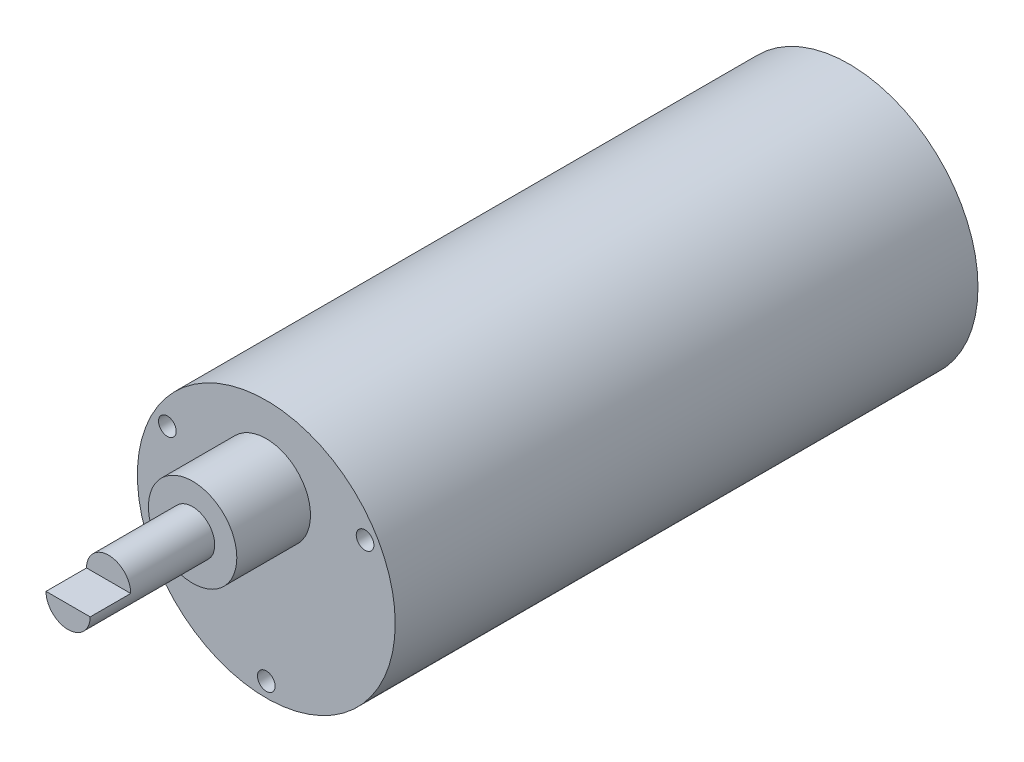
ISO-10303-21;
HEADER;
FILE_DESCRIPTION(('STEP AP214'),'2;1');
FILE_NAME('part.step','',(''),(''),'','','');
FILE_SCHEMA(('AUTOMOTIVE_DESIGN { 1 0 10303 214 1 1 1 1 }'));
ENDSEC;
DATA;
#1=APPLICATION_CONTEXT('core data for automotive mechanical design processes');
#2=APPLICATION_PROTOCOL_DEFINITION('international standard','automotive_design',2000,#1);
#3=PRODUCT_CONTEXT('',#1,'mechanical');
#4=PRODUCT('Part','Part','',(#3));
#5=PRODUCT_RELATED_PRODUCT_CATEGORY('part','',(#4));
#6=PRODUCT_DEFINITION_FORMATION('','',#4);
#7=PRODUCT_DEFINITION_CONTEXT('part definition',#1,'design');
#8=PRODUCT_DEFINITION('design','',#6,#7);
#9=PRODUCT_DEFINITION_SHAPE('','',#8);
#10=(LENGTH_UNIT() NAMED_UNIT(*) SI_UNIT(.MILLI.,.METRE.));
#11=(NAMED_UNIT(*) PLANE_ANGLE_UNIT() SI_UNIT($,.RADIAN.));
#12=(NAMED_UNIT(*) SI_UNIT($,.STERADIAN.) SOLID_ANGLE_UNIT());
#13=UNCERTAINTY_MEASURE_WITH_UNIT(LENGTH_MEASURE(1.E-05),#10,'distance_accuracy_value','');
#14=(GEOMETRIC_REPRESENTATION_CONTEXT(3) GLOBAL_UNCERTAINTY_ASSIGNED_CONTEXT((#13)) GLOBAL_UNIT_ASSIGNED_CONTEXT((#10,
#11,#12)) REPRESENTATION_CONTEXT('',''));
#15=CARTESIAN_POINT('',(0.,0.,0.));
#16=DIRECTION('',(0.,0.,1.));
#17=DIRECTION('',(1.,0.,0.));
#18=AXIS2_PLACEMENT_3D('',#15,#16,#17);
#19=CARTESIAN_POINT('',(0.,7.,89.1));
#20=DIRECTION('',(0.,0.,1.));
#21=DIRECTION('',(1.,0.,0.));
#22=AXIS2_PLACEMENT_3D('',#19,#20,#21);
#23=PLANE('',#22);
#24=CARTESIAN_POINT('',(0.,7.,89.1));
#25=DIRECTION('',(0.,0.,1.));
#26=DIRECTION('',(1.,0.,0.));
#27=AXIS2_PLACEMENT_3D('',#24,#25,#26);
#28=CIRCLE('',#27,6.);
#29=CARTESIAN_POINT('',(6.,7.,89.1));
#30=VERTEX_POINT('',#29);
#31=EDGE_CURVE('E111',#30,#30,#28,.T.);
#32=ORIENTED_EDGE('',*,*,#31,.T.);
#33=EDGE_LOOP('',(#32));
#34=FACE_BOUND('',#33,.T.);
#35=CARTESIAN_POINT('',(0.,7.,89.1));
#36=DIRECTION('',(0.,0.,1.));
#37=DIRECTION('',(1.,0.,0.));
#38=AXIS2_PLACEMENT_3D('',#35,#36,#37);
#39=CIRCLE('',#38,3.);
#40=CARTESIAN_POINT('',(3.,7.,89.1));
#41=VERTEX_POINT('',#40);
#42=EDGE_CURVE('E103',#41,#41,#39,.T.);
#43=ORIENTED_EDGE('',*,*,#42,.F.);
#44=EDGE_LOOP('',(#43));
#45=FACE_BOUND('',#44,.T.);
#46=ADVANCED_FACE('F33',(#34,#45),#23,.T.);
#47=CARTESIAN_POINT('',(0.,0.,79.1));
#48=DIRECTION('',(0.,0.,1.));
#49=DIRECTION('',(1.,0.,0.));
#50=AXIS2_PLACEMENT_3D('',#47,#48,#49);
#51=PLANE('',#50);
#52=CARTESIAN_POINT('',(13.4063552295801,7.77943696280851,79.1));
#53=DIRECTION('',(0.,0.,1.));
#54=DIRECTION('',(1.,0.,0.));
#55=AXIS2_PLACEMENT_3D('',#52,#53,#54);
#56=CIRCLE('',#55,1.19999999999999);
#57=CARTESIAN_POINT('',(14.6063552295801,7.77943696280851,79.1));
#58=VERTEX_POINT('',#57);
#59=EDGE_CURVE('E81',#58,#58,#56,.T.);
#60=ORIENTED_EDGE('',*,*,#59,.F.);
#61=EDGE_LOOP('',(#60));
#62=FACE_BOUND('',#61,.T.);
#63=CARTESIAN_POINT('',(0.,-15.5,79.1));
#64=DIRECTION('',(0.,0.,1.));
#65=DIRECTION('',(1.,0.,0.));
#66=AXIS2_PLACEMENT_3D('',#63,#64,#65);
#67=CIRCLE('',#66,1.19999999999999);
#68=CARTESIAN_POINT('',(1.19999999999999,-15.5,79.1));
#69=VERTEX_POINT('',#68);
#70=EDGE_CURVE('E80',#69,#69,#67,.T.);
#71=ORIENTED_EDGE('',*,*,#70,.F.);
#72=EDGE_LOOP('',(#71));
#73=FACE_BOUND('',#72,.T.);
#74=CARTESIAN_POINT('',(-13.4233937586588,7.75,79.1));
#75=DIRECTION('',(0.,0.,1.));
#76=DIRECTION('',(1.,0.,0.));
#77=AXIS2_PLACEMENT_3D('',#74,#75,#76);
#78=CIRCLE('',#77,1.19999999999999);
#79=CARTESIAN_POINT('',(-12.2233937586588,7.75,79.1));
#80=VERTEX_POINT('',#79);
#81=EDGE_CURVE('E91',#80,#80,#78,.T.);
#82=ORIENTED_EDGE('',*,*,#81,.F.);
#83=EDGE_LOOP('',(#82));
#84=FACE_BOUND('',#83,.T.);
#85=CARTESIAN_POINT('',(0.,0.,79.1));
#86=DIRECTION('',(0.,0.,1.));
#87=DIRECTION('',(1.,0.,0.));
#88=AXIS2_PLACEMENT_3D('',#85,#86,#87);
#89=CIRCLE('',#88,17.5);
#90=CARTESIAN_POINT('',(17.5,0.,79.1));
#91=VERTEX_POINT('',#90);
#92=EDGE_CURVE('E41',#91,#91,#89,.T.);
#93=ORIENTED_EDGE('',*,*,#92,.T.);
#94=EDGE_LOOP('',(#93));
#95=FACE_BOUND('',#94,.T.);
#96=CARTESIAN_POINT('',(0.,7.,79.1));
#97=DIRECTION('',(0.,0.,1.));
#98=DIRECTION('',(1.,0.,0.));
#99=AXIS2_PLACEMENT_3D('',#96,#97,#98);
#100=CIRCLE('',#99,6.);
#101=CARTESIAN_POINT('',(6.,7.,79.1));
#102=VERTEX_POINT('',#101);
#103=EDGE_CURVE('E108',#102,#102,#100,.T.);
#104=ORIENTED_EDGE('',*,*,#103,.F.);
#105=EDGE_LOOP('',(#104));
#106=FACE_BOUND('',#105,.T.);
#107=ADVANCED_FACE('F132',(#62,#73,#84,#95,#106),#51,.T.);
#108=CARTESIAN_POINT('',(0.,0.,79.1));
#109=DIRECTION('',(0.,0.,-1.));
#110=DIRECTION('',(-1.,0.,0.));
#111=AXIS2_PLACEMENT_3D('',#108,#109,#110);
#112=CYLINDRICAL_SURFACE('',#111,17.5);
#113=ORIENTED_EDGE('',*,*,#92,.F.);
#114=EDGE_LOOP('',(#113));
#115=FACE_BOUND('',#114,.T.);
#116=CARTESIAN_POINT('',(0.,0.,0.));
#117=DIRECTION('',(0.,0.,1.));
#118=DIRECTION('',(1.,0.,0.));
#119=AXIS2_PLACEMENT_3D('',#116,#117,#118);
#120=CIRCLE('',#119,17.5);
#121=CARTESIAN_POINT('',(17.5,0.,0.));
#122=VERTEX_POINT('',#121);
#123=EDGE_CURVE('E114',#122,#122,#120,.T.);
#124=ORIENTED_EDGE('',*,*,#123,.T.);
#125=EDGE_LOOP('',(#124));
#126=FACE_BOUND('',#125,.T.);
#127=ADVANCED_FACE('F35',(#115,#126),#112,.T.);
#128=CARTESIAN_POINT('',(0.,0.,0.));
#129=DIRECTION('',(0.,0.,1.));
#130=DIRECTION('',(1.,0.,0.));
#131=AXIS2_PLACEMENT_3D('',#128,#129,#130);
#132=PLANE('',#131);
#133=ORIENTED_EDGE('',*,*,#123,.F.);
#134=EDGE_LOOP('',(#133));
#135=FACE_BOUND('',#134,.T.);
#136=ADVANCED_FACE('F122',(#135),#132,.F.);
#137=CARTESIAN_POINT('',(0.,7.,89.1));
#138=DIRECTION('',(0.,0.,-1.));
#139=DIRECTION('',(-1.,0.,0.));
#140=AXIS2_PLACEMENT_3D('',#137,#138,#139);
#141=CYLINDRICAL_SURFACE('',#140,6.);
#142=ORIENTED_EDGE('',*,*,#31,.F.);
#143=EDGE_LOOP('',(#142));
#144=FACE_BOUND('',#143,.T.);
#145=ORIENTED_EDGE('',*,*,#103,.T.);
#146=EDGE_LOOP('',(#145));
#147=FACE_BOUND('',#146,.T.);
#148=ADVANCED_FACE('F124',(#144,#147),#141,.T.);
#149=CARTESIAN_POINT('',(0.,7.,106.));
#150=DIRECTION('',(0.,0.,-1.));
#151=DIRECTION('',(-1.,0.,0.));
#152=AXIS2_PLACEMENT_3D('',#149,#150,#151);
#153=CYLINDRICAL_SURFACE('',#152,3.);
#154=CARTESIAN_POINT('',(0.,7.,106.));
#155=DIRECTION('',(0.,0.,1.));
#156=DIRECTION('',(1.,0.,0.));
#157=AXIS2_PLACEMENT_3D('',#154,#155,#156);
#158=CIRCLE('',#157,3.);
#159=CARTESIAN_POINT('',(-3.,7.,106.));
#160=VERTEX_POINT('',#159);
#161=CARTESIAN_POINT('',(3.,7.,106.));
#162=VERTEX_POINT('',#161);
#163=EDGE_CURVE('E105',#160,#162,#158,.T.);
#164=ORIENTED_EDGE('',*,*,#163,.F.);
#165=DIRECTION('',(0.,0.,1.));
#166=VECTOR('',#165,1.);
#167=CARTESIAN_POINT('',(-3.,7.,100.5));
#168=LINE('',#167,#166);
#169=CARTESIAN_POINT('',(-3.,7.,100.5));
#170=VERTEX_POINT('',#169);
#171=EDGE_CURVE('E48',#170,#160,#168,.T.);
#172=ORIENTED_EDGE('',*,*,#171,.F.);
#173=CARTESIAN_POINT('',(0.,7.,100.5));
#174=DIRECTION('',(0.,0.,1.));
#175=DIRECTION('',(1.,0.,0.));
#176=AXIS2_PLACEMENT_3D('',#173,#174,#175);
#177=CIRCLE('',#176,3.);
#178=CARTESIAN_POINT('',(3.,7.,100.5));
#179=VERTEX_POINT('',#178);
#180=EDGE_CURVE('E11',#179,#170,#177,.T.);
#181=ORIENTED_EDGE('',*,*,#180,.F.);
#182=DIRECTION('',(0.,0.,1.));
#183=VECTOR('',#182,1.);
#184=CARTESIAN_POINT('',(3.,7.,100.5));
#185=LINE('',#184,#183);
#186=EDGE_CURVE('E101',#179,#162,#185,.T.);
#187=ORIENTED_EDGE('',*,*,#186,.T.);
#188=EDGE_LOOP('',(#164,#172,#181,#187));
#189=FACE_BOUND('',#188,.T.);
#190=ORIENTED_EDGE('',*,*,#42,.T.);
#191=EDGE_LOOP('',(#190));
#192=FACE_BOUND('',#191,.T.);
#193=ADVANCED_FACE('F129',(#189,#192),#153,.T.);
#194=CARTESIAN_POINT('',(0.,7.,106.));
#195=DIRECTION('',(0.,0.,1.));
#196=DIRECTION('',(1.,0.,0.));
#197=AXIS2_PLACEMENT_3D('',#194,#195,#196);
#198=PLANE('',#197);
#199=DIRECTION('',(1.,0.,0.));
#200=VECTOR('',#199,1.);
#201=CARTESIAN_POINT('',(-3.,7.,106.));
#202=LINE('',#201,#200);
#203=EDGE_CURVE('E60',#160,#162,#202,.T.);
#204=ORIENTED_EDGE('',*,*,#203,.F.);
#205=ORIENTED_EDGE('',*,*,#163,.T.);
#206=EDGE_LOOP('',(#204,#205));
#207=FACE_BOUND('',#206,.T.);
#208=ADVANCED_FACE('F146',(#207),#198,.T.);
#209=CARTESIAN_POINT('',(-3.,7.,100.5));
#210=DIRECTION('',(0.,0.,1.));
#211=DIRECTION('',(1.,0.,0.));
#212=AXIS2_PLACEMENT_3D('',#209,#210,#211);
#213=PLANE('',#212);
#214=DIRECTION('',(1.,0.,0.));
#215=VECTOR('',#214,1.);
#216=CARTESIAN_POINT('',(-3.,7.,100.5));
#217=LINE('',#216,#215);
#218=EDGE_CURVE('E97',#170,#179,#217,.T.);
#219=ORIENTED_EDGE('',*,*,#218,.T.);
#220=ORIENTED_EDGE('',*,*,#180,.T.);
#221=EDGE_LOOP('',(#219,#220));
#222=FACE_BOUND('',#221,.T.);
#223=ADVANCED_FACE('F149',(#222),#213,.T.);
#224=CARTESIAN_POINT('',(-3.,7.,100.5));
#225=DIRECTION('',(0.,-1.,0.));
#226=DIRECTION('',(0.,0.,-1.));
#227=AXIS2_PLACEMENT_3D('',#224,#225,#226);
#228=PLANE('',#227);
#229=ORIENTED_EDGE('',*,*,#203,.T.);
#230=ORIENTED_EDGE('',*,*,#186,.F.);
#231=ORIENTED_EDGE('',*,*,#218,.F.);
#232=ORIENTED_EDGE('',*,*,#171,.T.);
#233=EDGE_LOOP('',(#229,#230,#231,#232));
#234=FACE_BOUND('',#233,.T.);
#235=ADVANCED_FACE('F151',(#234),#228,.F.);
#236=CARTESIAN_POINT('',(-13.4233937586588,7.75,69.1));
#237=DIRECTION('',(0.,0.,1.));
#238=DIRECTION('',(1.,0.,0.));
#239=AXIS2_PLACEMENT_3D('',#236,#237,#238);
#240=CONICAL_SURFACE('',#239,1.19999999999999,1.02974425867665);
#241=CARTESIAN_POINT('',(-13.4233937586588,7.75,68.3789672571669));
#242=VERTEX_POINT('',#241);
#243=VERTEX_LOOP('',#242);
#244=FACE_BOUND('',#243,.T.);
#245=CARTESIAN_POINT('',(-13.4233937586588,7.75,69.1));
#246=DIRECTION('',(0.,0.,1.));
#247=DIRECTION('',(1.,0.,0.));
#248=AXIS2_PLACEMENT_3D('',#245,#246,#247);
#249=CIRCLE('',#248,1.19999999999999);
#250=CARTESIAN_POINT('',(-12.2233937586588,7.75,69.1));
#251=VERTEX_POINT('',#250);
#252=EDGE_CURVE('E94',#251,#251,#249,.T.);
#253=ORIENTED_EDGE('',*,*,#252,.T.);
#254=EDGE_LOOP('',(#253));
#255=FACE_BOUND('',#254,.T.);
#256=ADVANCED_FACE('F154',(#244,#255),#240,.F.);
#257=CARTESIAN_POINT('',(-13.4233937586588,7.75,79.1));
#258=DIRECTION('',(0.,0.,1.));
#259=DIRECTION('',(1.,0.,0.));
#260=AXIS2_PLACEMENT_3D('',#257,#258,#259);
#261=CYLINDRICAL_SURFACE('',#260,1.19999999999999);
#262=ORIENTED_EDGE('',*,*,#252,.F.);
#263=EDGE_LOOP('',(#262));
#264=FACE_BOUND('',#263,.T.);
#265=ORIENTED_EDGE('',*,*,#81,.T.);
#266=EDGE_LOOP('',(#265));
#267=FACE_BOUND('',#266,.T.);
#268=ADVANCED_FACE('F160',(#264,#267),#261,.F.);
#269=CARTESIAN_POINT('',(0.,-15.5,69.1));
#270=DIRECTION('',(0.,0.,1.));
#271=DIRECTION('',(1.,0.,0.));
#272=AXIS2_PLACEMENT_3D('',#269,#270,#271);
#273=CONICAL_SURFACE('',#272,1.19999999999999,1.02974425867665);
#274=CARTESIAN_POINT('',(0.,-15.5,68.3789672571669));
#275=VERTEX_POINT('',#274);
#276=VERTEX_LOOP('',#275);
#277=FACE_BOUND('',#276,.T.);
#278=CARTESIAN_POINT('',(0.,-15.5,69.1));
#279=DIRECTION('',(0.,0.,1.));
#280=DIRECTION('',(1.,0.,0.));
#281=AXIS2_PLACEMENT_3D('',#278,#279,#280);
#282=CIRCLE('',#281,1.19999999999999);
#283=CARTESIAN_POINT('',(1.19999999999999,-15.5,69.1));
#284=VERTEX_POINT('',#283);
#285=EDGE_CURVE('E84',#284,#284,#282,.T.);
#286=ORIENTED_EDGE('',*,*,#285,.T.);
#287=EDGE_LOOP('',(#286));
#288=FACE_BOUND('',#287,.T.);
#289=ADVANCED_FACE('F163',(#277,#288),#273,.F.);
#290=CARTESIAN_POINT('',(0.,-15.5,79.1));
#291=DIRECTION('',(0.,0.,1.));
#292=DIRECTION('',(1.,0.,0.));
#293=AXIS2_PLACEMENT_3D('',#290,#291,#292);
#294=CYLINDRICAL_SURFACE('',#293,1.19999999999999);
#295=ORIENTED_EDGE('',*,*,#285,.F.);
#296=EDGE_LOOP('',(#295));
#297=FACE_BOUND('',#296,.T.);
#298=ORIENTED_EDGE('',*,*,#70,.T.);
#299=EDGE_LOOP('',(#298));
#300=FACE_BOUND('',#299,.T.);
#301=ADVANCED_FACE('F74',(#297,#300),#294,.F.);
#302=CARTESIAN_POINT('',(13.4063552295801,7.77943696280851,69.1));
#303=DIRECTION('',(0.,0.,1.));
#304=DIRECTION('',(1.,0.,0.));
#305=AXIS2_PLACEMENT_3D('',#302,#303,#304);
#306=CONICAL_SURFACE('',#305,1.19999999999999,1.02974425867665);
#307=CARTESIAN_POINT('',(13.4063552295801,7.77943696280851,68.3789672571669));
#308=VERTEX_POINT('',#307);
#309=VERTEX_LOOP('',#308);
#310=FACE_BOUND('',#309,.T.);
#311=CARTESIAN_POINT('',(13.4063552295801,7.77943696280851,69.1));
#312=DIRECTION('',(0.,0.,1.));
#313=DIRECTION('',(1.,0.,0.));
#314=AXIS2_PLACEMENT_3D('',#311,#312,#313);
#315=CIRCLE('',#314,1.19999999999999);
#316=CARTESIAN_POINT('',(14.6063552295801,7.77943696280851,69.1));
#317=VERTEX_POINT('',#316);
#318=EDGE_CURVE('E78',#317,#317,#315,.T.);
#319=ORIENTED_EDGE('',*,*,#318,.T.);
#320=EDGE_LOOP('',(#319));
#321=FACE_BOUND('',#320,.T.);
#322=ADVANCED_FACE('F70',(#310,#321),#306,.F.);
#323=CARTESIAN_POINT('',(13.4063552295801,7.77943696280851,79.1));
#324=DIRECTION('',(0.,0.,1.));
#325=DIRECTION('',(1.,0.,0.));
#326=AXIS2_PLACEMENT_3D('',#323,#324,#325);
#327=CYLINDRICAL_SURFACE('',#326,1.19999999999999);
#328=ORIENTED_EDGE('',*,*,#318,.F.);
#329=EDGE_LOOP('',(#328));
#330=FACE_BOUND('',#329,.T.);
#331=ORIENTED_EDGE('',*,*,#59,.T.);
#332=EDGE_LOOP('',(#331));
#333=FACE_BOUND('',#332,.T.);
#334=ADVANCED_FACE('F73',(#330,#333),#327,.F.);
#335=CLOSED_SHELL('',(#46,#107,#127,#136,#148,#193,#208,#223,#235,#256,#268,#289,#301,#322,#334));
#336=MANIFOLD_SOLID_BREP('B2',#335);
#337=ADVANCED_BREP_SHAPE_REPRESENTATION('',(#18,#336),#14);
#338=SHAPE_DEFINITION_REPRESENTATION(#9,#337);
ENDSEC;
END-ISO-10303-21;
